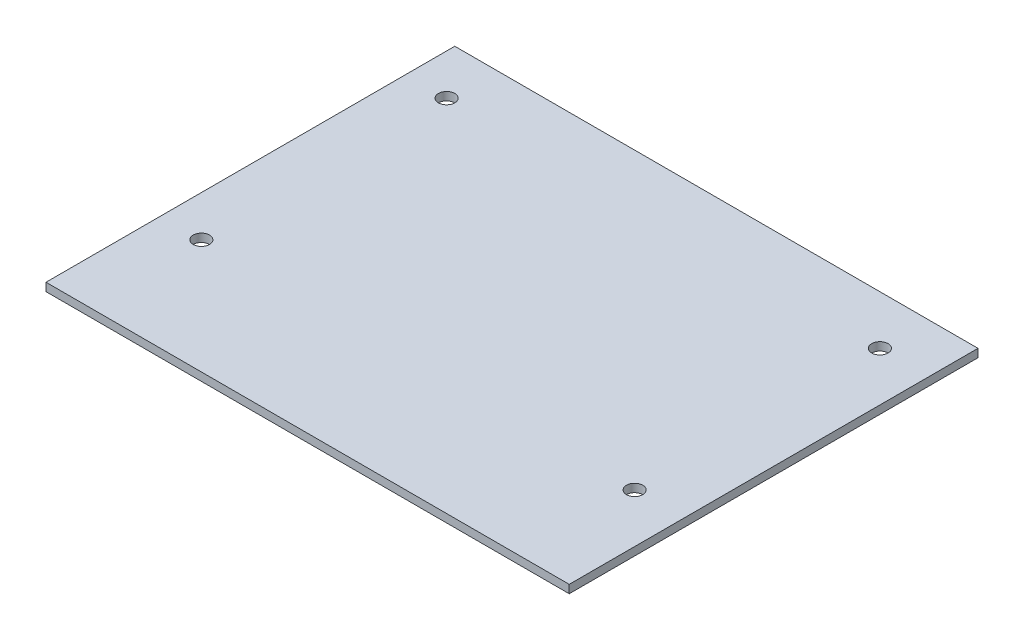
ISO-10303-21;
HEADER;
FILE_DESCRIPTION(('STEP AP214'),'2;1');
FILE_NAME('part.step','',(''),(''),'','','');
FILE_SCHEMA(('AUTOMOTIVE_DESIGN { 1 0 10303 214 1 1 1 1 }'));
ENDSEC;
DATA;
#1=APPLICATION_CONTEXT('core data for automotive mechanical design processes');
#2=APPLICATION_PROTOCOL_DEFINITION('international standard','automotive_design',2000,#1);
#3=PRODUCT_CONTEXT('',#1,'mechanical');
#4=PRODUCT('Part','Part','',(#3));
#5=PRODUCT_RELATED_PRODUCT_CATEGORY('part','',(#4));
#6=PRODUCT_DEFINITION_FORMATION('','',#4);
#7=PRODUCT_DEFINITION_CONTEXT('part definition',#1,'design');
#8=PRODUCT_DEFINITION('design','',#6,#7);
#9=PRODUCT_DEFINITION_SHAPE('','',#8);
#10=(LENGTH_UNIT() NAMED_UNIT(*) SI_UNIT(.MILLI.,.METRE.));
#11=(NAMED_UNIT(*) PLANE_ANGLE_UNIT() SI_UNIT($,.RADIAN.));
#12=(NAMED_UNIT(*) SI_UNIT($,.STERADIAN.) SOLID_ANGLE_UNIT());
#13=UNCERTAINTY_MEASURE_WITH_UNIT(LENGTH_MEASURE(1.E-05),#10,'distance_accuracy_value','');
#14=(GEOMETRIC_REPRESENTATION_CONTEXT(3) GLOBAL_UNCERTAINTY_ASSIGNED_CONTEXT((#13)) GLOBAL_UNIT_ASSIGNED_CONTEXT((#10,
#11,#12)) REPRESENTATION_CONTEXT('',''));
#15=CARTESIAN_POINT('',(0.,0.,0.));
#16=DIRECTION('',(0.,0.,1.));
#17=DIRECTION('',(1.,0.,0.));
#18=AXIS2_PLACEMENT_3D('',#15,#16,#17);
#19=CARTESIAN_POINT('',(203.2,6.35,-158.75));
#20=DIRECTION('',(-1.,0.,0.));
#21=DIRECTION('',(0.,0.,1.));
#22=AXIS2_PLACEMENT_3D('',#19,#20,#21);
#23=PLANE('',#22);
#24=DIRECTION('',(0.,0.,-1.));
#25=VECTOR('',#24,1.);
#26=CARTESIAN_POINT('',(203.2,0.,-158.75));
#27=LINE('',#26,#25);
#28=CARTESIAN_POINT('',(203.2,0.,158.75));
#29=VERTEX_POINT('',#28);
#30=CARTESIAN_POINT('',(203.2,0.,-158.75));
#31=VERTEX_POINT('',#30);
#32=EDGE_CURVE('E99',#29,#31,#27,.T.);
#33=ORIENTED_EDGE('',*,*,#32,.T.);
#34=DIRECTION('',(0.,-1.,0.));
#35=VECTOR('',#34,1.);
#36=CARTESIAN_POINT('',(203.2,6.35,-158.75));
#37=LINE('',#36,#35);
#38=CARTESIAN_POINT('',(203.2,6.35,-158.75));
#39=VERTEX_POINT('',#38);
#40=EDGE_CURVE('E11',#39,#31,#37,.T.);
#41=ORIENTED_EDGE('',*,*,#40,.F.);
#42=DIRECTION('',(0.,0.,-1.));
#43=VECTOR('',#42,1.);
#44=CARTESIAN_POINT('',(203.2,6.35,-158.75));
#45=LINE('',#44,#43);
#46=CARTESIAN_POINT('',(203.2,6.35,158.75));
#47=VERTEX_POINT('',#46);
#48=EDGE_CURVE('E86',#47,#39,#45,.T.);
#49=ORIENTED_EDGE('',*,*,#48,.F.);
#50=DIRECTION('',(0.,-1.,0.));
#51=VECTOR('',#50,1.);
#52=CARTESIAN_POINT('',(203.2,6.35,158.75));
#53=LINE('',#52,#51);
#54=EDGE_CURVE('E95',#47,#29,#53,.T.);
#55=ORIENTED_EDGE('',*,*,#54,.T.);
#56=EDGE_LOOP('',(#33,#41,#49,#55));
#57=FACE_BOUND('',#56,.T.);
#58=ADVANCED_FACE('F33',(#57),#23,.F.);
#59=CARTESIAN_POINT('',(-203.2,6.35,-158.75));
#60=DIRECTION('',(0.,0.,1.));
#61=DIRECTION('',(1.,0.,0.));
#62=AXIS2_PLACEMENT_3D('',#59,#60,#61);
#63=PLANE('',#62);
#64=DIRECTION('',(-1.,0.,0.));
#65=VECTOR('',#64,1.);
#66=CARTESIAN_POINT('',(-203.2,0.,-158.75));
#67=LINE('',#66,#65);
#68=CARTESIAN_POINT('',(-203.2,0.,-158.75));
#69=VERTEX_POINT('',#68);
#70=EDGE_CURVE('E90',#31,#69,#67,.T.);
#71=ORIENTED_EDGE('',*,*,#70,.T.);
#72=DIRECTION('',(0.,-1.,0.));
#73=VECTOR('',#72,1.);
#74=CARTESIAN_POINT('',(-203.2,6.35,-158.75));
#75=LINE('',#74,#73);
#76=CARTESIAN_POINT('',(-203.2,6.35,-158.75));
#77=VERTEX_POINT('',#76);
#78=EDGE_CURVE('E42',#77,#69,#75,.T.);
#79=ORIENTED_EDGE('',*,*,#78,.F.);
#80=DIRECTION('',(-1.,0.,0.));
#81=VECTOR('',#80,1.);
#82=CARTESIAN_POINT('',(-203.2,6.35,-158.75));
#83=LINE('',#82,#81);
#84=EDGE_CURVE('E81',#39,#77,#83,.T.);
#85=ORIENTED_EDGE('',*,*,#84,.F.);
#86=ORIENTED_EDGE('',*,*,#40,.T.);
#87=EDGE_LOOP('',(#71,#79,#85,#86));
#88=FACE_BOUND('',#87,.T.);
#89=ADVANCED_FACE('F89',(#88),#63,.F.);
#90=CARTESIAN_POINT('',(-203.2,6.35,-158.75));
#91=DIRECTION('',(1.,0.,0.));
#92=DIRECTION('',(0.,0.,-1.));
#93=AXIS2_PLACEMENT_3D('',#90,#91,#92);
#94=PLANE('',#93);
#95=DIRECTION('',(0.,0.,1.));
#96=VECTOR('',#95,1.);
#97=CARTESIAN_POINT('',(-203.2,0.,-158.75));
#98=LINE('',#97,#96);
#99=CARTESIAN_POINT('',(-203.2,0.,158.75));
#100=VERTEX_POINT('',#99);
#101=EDGE_CURVE('E68',#69,#100,#98,.T.);
#102=ORIENTED_EDGE('',*,*,#101,.T.);
#103=DIRECTION('',(0.,-1.,0.));
#104=VECTOR('',#103,1.);
#105=CARTESIAN_POINT('',(-203.2,6.35,158.75));
#106=LINE('',#105,#104);
#107=CARTESIAN_POINT('',(-203.2,6.35,158.75));
#108=VERTEX_POINT('',#107);
#109=EDGE_CURVE('E91',#108,#100,#106,.T.);
#110=ORIENTED_EDGE('',*,*,#109,.F.);
#111=DIRECTION('',(0.,0.,1.));
#112=VECTOR('',#111,1.);
#113=CARTESIAN_POINT('',(-203.2,6.35,-158.75));
#114=LINE('',#113,#112);
#115=EDGE_CURVE('E84',#77,#108,#114,.T.);
#116=ORIENTED_EDGE('',*,*,#115,.F.);
#117=ORIENTED_EDGE('',*,*,#78,.T.);
#118=EDGE_LOOP('',(#102,#110,#116,#117));
#119=FACE_BOUND('',#118,.T.);
#120=ADVANCED_FACE('F93',(#119),#94,.F.);
#121=CARTESIAN_POINT('',(-203.2,6.35,158.75));
#122=DIRECTION('',(0.,0.,-1.));
#123=DIRECTION('',(-1.,0.,0.));
#124=AXIS2_PLACEMENT_3D('',#121,#122,#123);
#125=PLANE('',#124);
#126=DIRECTION('',(1.,0.,0.));
#127=VECTOR('',#126,1.);
#128=CARTESIAN_POINT('',(-203.2,0.,158.75));
#129=LINE('',#128,#127);
#130=EDGE_CURVE('E74',#100,#29,#129,.T.);
#131=ORIENTED_EDGE('',*,*,#130,.T.);
#132=ORIENTED_EDGE('',*,*,#54,.F.);
#133=DIRECTION('',(1.,0.,0.));
#134=VECTOR('',#133,1.);
#135=CARTESIAN_POINT('',(-203.2,6.35,158.75));
#136=LINE('',#135,#134);
#137=EDGE_CURVE('E51',#108,#47,#136,.T.);
#138=ORIENTED_EDGE('',*,*,#137,.F.);
#139=ORIENTED_EDGE('',*,*,#109,.T.);
#140=EDGE_LOOP('',(#131,#132,#138,#139));
#141=FACE_BOUND('',#140,.T.);
#142=ADVANCED_FACE('F156',(#141),#125,.F.);
#143=CARTESIAN_POINT('',(0.,6.35,0.));
#144=DIRECTION('',(0.,1.,0.));
#145=DIRECTION('',(0.,0.,1.));
#146=AXIS2_PLACEMENT_3D('',#143,#144,#145);
#147=PLANE('',#146);
#148=CARTESIAN_POINT('',(-171.45,6.35,-120.65));
#149=DIRECTION('',(0.,1.,0.));
#150=DIRECTION('',(0.,0.,1.));
#151=AXIS2_PLACEMENT_3D('',#148,#149,#150);
#152=CIRCLE('',#151,6.34999999999999);
#153=CARTESIAN_POINT('',(-171.45,6.35,-114.3));
#154=VERTEX_POINT('',#153);
#155=EDGE_CURVE('E124',#154,#154,#152,.T.);
#156=ORIENTED_EDGE('',*,*,#155,.F.);
#157=EDGE_LOOP('',(#156));
#158=FACE_BOUND('',#157,.T.);
#159=CARTESIAN_POINT('',(165.1,6.35,-120.65));
#160=DIRECTION('',(0.,1.,0.));
#161=DIRECTION('',(0.,0.,1.));
#162=AXIS2_PLACEMENT_3D('',#159,#160,#161);
#163=CIRCLE('',#162,6.34999999999999);
#164=CARTESIAN_POINT('',(165.1,6.35,-114.3));
#165=VERTEX_POINT('',#164);
#166=EDGE_CURVE('E114',#165,#165,#163,.T.);
#167=ORIENTED_EDGE('',*,*,#166,.F.);
#168=EDGE_LOOP('',(#167));
#169=FACE_BOUND('',#168,.T.);
#170=CARTESIAN_POINT('',(165.1,6.35,69.8499999999999));
#171=DIRECTION('',(0.,1.,0.));
#172=DIRECTION('',(0.,0.,1.));
#173=AXIS2_PLACEMENT_3D('',#170,#171,#172);
#174=CIRCLE('',#173,6.34999999999999);
#175=CARTESIAN_POINT('',(165.1,6.35,76.1999999999999));
#176=VERTEX_POINT('',#175);
#177=EDGE_CURVE('E111',#176,#176,#174,.T.);
#178=ORIENTED_EDGE('',*,*,#177,.F.);
#179=EDGE_LOOP('',(#178));
#180=FACE_BOUND('',#179,.T.);
#181=CARTESIAN_POINT('',(-171.45,6.35,69.8499999999999));
#182=DIRECTION('',(0.,1.,0.));
#183=DIRECTION('',(0.,0.,1.));
#184=AXIS2_PLACEMENT_3D('',#181,#182,#183);
#185=CIRCLE('',#184,6.34999999999999);
#186=CARTESIAN_POINT('',(-171.45,6.35,76.1999999999999));
#187=VERTEX_POINT('',#186);
#188=EDGE_CURVE('E110',#187,#187,#185,.T.);
#189=ORIENTED_EDGE('',*,*,#188,.F.);
#190=EDGE_LOOP('',(#189));
#191=FACE_BOUND('',#190,.T.);
#192=ORIENTED_EDGE('',*,*,#48,.T.);
#193=ORIENTED_EDGE('',*,*,#84,.T.);
#194=ORIENTED_EDGE('',*,*,#115,.T.);
#195=ORIENTED_EDGE('',*,*,#137,.T.);
#196=EDGE_LOOP('',(#192,#193,#194,#195));
#197=FACE_BOUND('',#196,.T.);
#198=ADVANCED_FACE('F82',(#158,#169,#180,#191,#197),#147,.T.);
#199=CARTESIAN_POINT('',(0.,0.,0.));
#200=DIRECTION('',(0.,1.,0.));
#201=DIRECTION('',(0.,0.,1.));
#202=AXIS2_PLACEMENT_3D('',#199,#200,#201);
#203=PLANE('',#202);
#204=CARTESIAN_POINT('',(-171.45,0.,-120.65));
#205=DIRECTION('',(0.,1.,0.));
#206=DIRECTION('',(0.,0.,1.));
#207=AXIS2_PLACEMENT_3D('',#204,#205,#206);
#208=CIRCLE('',#207,6.34999999999999);
#209=CARTESIAN_POINT('',(-171.45,0.,-114.3));
#210=VERTEX_POINT('',#209);
#211=EDGE_CURVE('E36',#210,#210,#208,.T.);
#212=ORIENTED_EDGE('',*,*,#211,.T.);
#213=EDGE_LOOP('',(#212));
#214=FACE_BOUND('',#213,.T.);
#215=CARTESIAN_POINT('',(165.1,0.,-120.65));
#216=DIRECTION('',(0.,1.,0.));
#217=DIRECTION('',(0.,0.,1.));
#218=AXIS2_PLACEMENT_3D('',#215,#216,#217);
#219=CIRCLE('',#218,6.34999999999999);
#220=CARTESIAN_POINT('',(165.1,0.,-114.3));
#221=VERTEX_POINT('',#220);
#222=EDGE_CURVE('E112',#221,#221,#219,.T.);
#223=ORIENTED_EDGE('',*,*,#222,.T.);
#224=EDGE_LOOP('',(#223));
#225=FACE_BOUND('',#224,.T.);
#226=CARTESIAN_POINT('',(165.1,0.,69.8499999999999));
#227=DIRECTION('',(0.,1.,0.));
#228=DIRECTION('',(0.,0.,1.));
#229=AXIS2_PLACEMENT_3D('',#226,#227,#228);
#230=CIRCLE('',#229,6.34999999999999);
#231=CARTESIAN_POINT('',(165.1,0.,76.1999999999999));
#232=VERTEX_POINT('',#231);
#233=EDGE_CURVE('E108',#232,#232,#230,.T.);
#234=ORIENTED_EDGE('',*,*,#233,.T.);
#235=EDGE_LOOP('',(#234));
#236=FACE_BOUND('',#235,.T.);
#237=CARTESIAN_POINT('',(-171.45,0.,69.8499999999999));
#238=DIRECTION('',(0.,1.,0.));
#239=DIRECTION('',(0.,0.,1.));
#240=AXIS2_PLACEMENT_3D('',#237,#238,#239);
#241=CIRCLE('',#240,6.34999999999999);
#242=CARTESIAN_POINT('',(-171.45,0.,76.1999999999999));
#243=VERTEX_POINT('',#242);
#244=EDGE_CURVE('E102',#243,#243,#241,.T.);
#245=ORIENTED_EDGE('',*,*,#244,.T.);
#246=EDGE_LOOP('',(#245));
#247=FACE_BOUND('',#246,.T.);
#248=ORIENTED_EDGE('',*,*,#32,.F.);
#249=ORIENTED_EDGE('',*,*,#130,.F.);
#250=ORIENTED_EDGE('',*,*,#101,.F.);
#251=ORIENTED_EDGE('',*,*,#70,.F.);
#252=EDGE_LOOP('',(#248,#249,#250,#251));
#253=FACE_BOUND('',#252,.T.);
#254=ADVANCED_FACE('F132',(#214,#225,#236,#247,#253),#203,.F.);
#255=CARTESIAN_POINT('',(-171.45,6.35,69.8499999999999));
#256=DIRECTION('',(0.,1.,0.));
#257=DIRECTION('',(0.,0.,1.));
#258=AXIS2_PLACEMENT_3D('',#255,#256,#257);
#259=CYLINDRICAL_SURFACE('',#258,6.34999999999999);
#260=ORIENTED_EDGE('',*,*,#188,.T.);
#261=EDGE_LOOP('',(#260));
#262=FACE_BOUND('',#261,.T.);
#263=ORIENTED_EDGE('',*,*,#244,.F.);
#264=EDGE_LOOP('',(#263));
#265=FACE_BOUND('',#264,.T.);
#266=ADVANCED_FACE('F135',(#262,#265),#259,.F.);
#267=CARTESIAN_POINT('',(165.1,6.35,69.8499999999999));
#268=DIRECTION('',(0.,1.,0.));
#269=DIRECTION('',(0.,0.,1.));
#270=AXIS2_PLACEMENT_3D('',#267,#268,#269);
#271=CYLINDRICAL_SURFACE('',#270,6.34999999999999);
#272=ORIENTED_EDGE('',*,*,#177,.T.);
#273=EDGE_LOOP('',(#272));
#274=FACE_BOUND('',#273,.T.);
#275=ORIENTED_EDGE('',*,*,#233,.F.);
#276=EDGE_LOOP('',(#275));
#277=FACE_BOUND('',#276,.T.);
#278=ADVANCED_FACE('F137',(#274,#277),#271,.F.);
#279=CARTESIAN_POINT('',(165.1,6.35,-120.65));
#280=DIRECTION('',(0.,1.,0.));
#281=DIRECTION('',(0.,0.,1.));
#282=AXIS2_PLACEMENT_3D('',#279,#280,#281);
#283=CYLINDRICAL_SURFACE('',#282,6.34999999999999);
#284=ORIENTED_EDGE('',*,*,#166,.T.);
#285=EDGE_LOOP('',(#284));
#286=FACE_BOUND('',#285,.T.);
#287=ORIENTED_EDGE('',*,*,#222,.F.);
#288=EDGE_LOOP('',(#287));
#289=FACE_BOUND('',#288,.T.);
#290=ADVANCED_FACE('F144',(#286,#289),#283,.F.);
#291=CARTESIAN_POINT('',(-171.45,6.35,-120.65));
#292=DIRECTION('',(0.,1.,0.));
#293=DIRECTION('',(0.,0.,1.));
#294=AXIS2_PLACEMENT_3D('',#291,#292,#293);
#295=CYLINDRICAL_SURFACE('',#294,6.34999999999999);
#296=ORIENTED_EDGE('',*,*,#155,.T.);
#297=EDGE_LOOP('',(#296));
#298=FACE_BOUND('',#297,.T.);
#299=ORIENTED_EDGE('',*,*,#211,.F.);
#300=EDGE_LOOP('',(#299));
#301=FACE_BOUND('',#300,.T.);
#302=ADVANCED_FACE('F210',(#298,#301),#295,.F.);
#303=CLOSED_SHELL('',(#58,#89,#120,#142,#198,#254,#266,#278,#290,#302));
#304=MANIFOLD_SOLID_BREP('B2',#303);
#305=ADVANCED_BREP_SHAPE_REPRESENTATION('',(#18,#304),#14);
#306=SHAPE_DEFINITION_REPRESENTATION(#9,#305);
ENDSEC;
END-ISO-10303-21;
